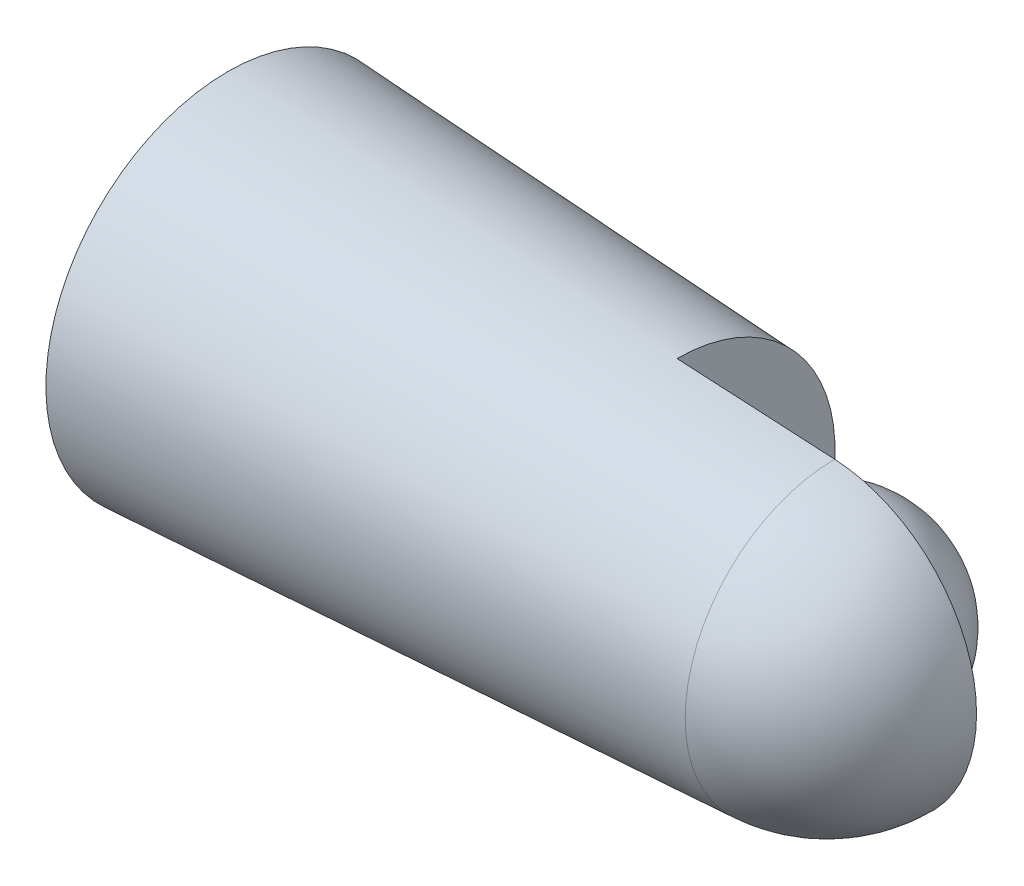
ISO-10303-21;
HEADER;
FILE_DESCRIPTION(('STEP AP214'),'2;1');
FILE_NAME('part.step','',(''),(''),'','','');
FILE_SCHEMA(('AUTOMOTIVE_DESIGN { 1 0 10303 214 1 1 1 1 }'));
ENDSEC;
DATA;
#1=APPLICATION_CONTEXT('core data for automotive mechanical design processes');
#2=APPLICATION_PROTOCOL_DEFINITION('international standard','automotive_design',2000,#1);
#3=PRODUCT_CONTEXT('',#1,'mechanical');
#4=PRODUCT('Part','Part','',(#3));
#5=PRODUCT_RELATED_PRODUCT_CATEGORY('part','',(#4));
#6=PRODUCT_DEFINITION_FORMATION('','',#4);
#7=PRODUCT_DEFINITION_CONTEXT('part definition',#1,'design');
#8=PRODUCT_DEFINITION('design','',#6,#7);
#9=PRODUCT_DEFINITION_SHAPE('','',#8);
#10=(LENGTH_UNIT() NAMED_UNIT(*) SI_UNIT(.MILLI.,.METRE.));
#11=(NAMED_UNIT(*) PLANE_ANGLE_UNIT() SI_UNIT($,.RADIAN.));
#12=(NAMED_UNIT(*) SI_UNIT($,.STERADIAN.) SOLID_ANGLE_UNIT());
#13=UNCERTAINTY_MEASURE_WITH_UNIT(LENGTH_MEASURE(1.E-05),#10,'distance_accuracy_value','');
#14=(GEOMETRIC_REPRESENTATION_CONTEXT(3) GLOBAL_UNCERTAINTY_ASSIGNED_CONTEXT((#13)) GLOBAL_UNIT_ASSIGNED_CONTEXT((#10,
#11,#12)) REPRESENTATION_CONTEXT('',''));
#15=CARTESIAN_POINT('',(0.,0.,0.));
#16=DIRECTION('',(0.,0.,1.));
#17=DIRECTION('',(1.,0.,0.));
#18=AXIS2_PLACEMENT_3D('',#15,#16,#17);
#19=CARTESIAN_POINT('',(0.,0.,0.));
#20=DIRECTION('',(1.,0.,0.));
#21=DIRECTION('',(0.,0.,1.));
#22=AXIS2_PLACEMENT_3D('',#19,#20,#21);
#23=SPHERICAL_SURFACE('',#22,35.);
#24=CARTESIAN_POINT('',(1.8599862468664,0.,0.));
#25=DIRECTION('',(1.,0.,0.));
#26=DIRECTION('',(0.,0.,-1.));
#27=AXIS2_PLACEMENT_3D('',#24,#25,#26);
#28=CIRCLE('',#27,34.950542930854);
#29=CARTESIAN_POINT('',(1.8599862468664,34.950542930854,0.));
#30=VERTEX_POINT('',#29);
#31=CARTESIAN_POINT('',(1.8599862468664,-34.950542930854,0.));
#32=VERTEX_POINT('',#31);
#33=EDGE_CURVE('E69',#30,#32,#28,.T.);
#34=ORIENTED_EDGE('',*,*,#33,.T.);
#35=CARTESIAN_POINT('',(0.,0.,0.));
#36=DIRECTION('',(0.,0.,1.));
#37=DIRECTION('',(1.,0.,0.));
#38=AXIS2_PLACEMENT_3D('',#35,#36,#37);
#39=CIRCLE('',#38,35.);
#40=EDGE_CURVE('E46',#30,#32,#39,.F.);
#41=ORIENTED_EDGE('',*,*,#40,.F.);
#42=EDGE_LOOP('',(#34,#41));
#43=FACE_BOUND('',#42,.T.);
#44=ADVANCED_FACE('F32',(#43),#23,.T.);
#45=CARTESIAN_POINT('',(1.8599862468664,0.,0.));
#46=DIRECTION('',(-1.,0.,0.));
#47=DIRECTION('',(0.,0.,1.));
#48=AXIS2_PLACEMENT_3D('',#45,#46,#47);
#49=CONICAL_SURFACE('',#48,34.950542930854,0.0531675095008227);
#50=DIRECTION('',(-0.998586940881543,0.0531424641961826,0.));
#51=VECTOR('',#50,1.);
#52=CARTESIAN_POINT('',(658.607020381907,0.,0.));
#53=LINE('',#52,#51);
#54=CARTESIAN_POINT('',(-35.0000000000001,36.9121452903507,0.));
#55=VERTEX_POINT('',#54);
#56=EDGE_CURVE('E11',#55,#30,#53,.F.);
#57=ORIENTED_EDGE('',*,*,#56,.F.);
#58=CARTESIAN_POINT('',(-35.,0.,0.));
#59=DIRECTION('',(-1.,0.,0.));
#60=DIRECTION('',(0.,0.,1.));
#61=AXIS2_PLACEMENT_3D('',#58,#59,#60);
#62=CIRCLE('',#61,36.9121452903507);
#63=CARTESIAN_POINT('',(-35.0000000000001,-36.9121452903508,0.));
#64=VERTEX_POINT('',#63);
#65=EDGE_CURVE('E40',#64,#55,#62,.F.);
#66=ORIENTED_EDGE('',*,*,#65,.F.);
#67=DIRECTION('',(0.998586940881543,0.0531424641961826,0.));
#68=VECTOR('',#67,1.);
#69=CARTESIAN_POINT('',(658.607020381907,0.,0.));
#70=LINE('',#69,#68);
#71=EDGE_CURVE('E61',#32,#64,#70,.F.);
#72=ORIENTED_EDGE('',*,*,#71,.F.);
#73=ORIENTED_EDGE('',*,*,#33,.F.);
#74=EDGE_LOOP('',(#57,#66,#72,#73));
#75=FACE_BOUND('',#74,.T.);
#76=CARTESIAN_POINT('',(-140.,0.,0.));
#77=DIRECTION('',(1.,0.,0.));
#78=DIRECTION('',(0.,0.,-1.));
#79=AXIS2_PLACEMENT_3D('',#76,#77,#78);
#80=CIRCLE('',#79,42.5);
#81=CARTESIAN_POINT('',(-140.,0.,-42.5));
#82=VERTEX_POINT('',#81);
#83=EDGE_CURVE('E71',#82,#82,#80,.T.);
#84=ORIENTED_EDGE('',*,*,#83,.T.);
#85=EDGE_LOOP('',(#84));
#86=FACE_BOUND('',#85,.T.);
#87=ADVANCED_FACE('F66',(#75,#86),#49,.T.);
#88=CARTESIAN_POINT('',(-140.,0.,0.));
#89=DIRECTION('',(-1.,0.,0.));
#90=DIRECTION('',(0.,0.,1.));
#91=AXIS2_PLACEMENT_3D('',#88,#89,#90);
#92=PLANE('',#91);
#93=CARTESIAN_POINT('',(-140.,0.,0.));
#94=DIRECTION('',(-1.,0.,0.));
#95=DIRECTION('',(0.,0.,1.));
#96=AXIS2_PLACEMENT_3D('',#93,#94,#95);
#97=CIRCLE('',#96,35.);
#98=CARTESIAN_POINT('',(-140.,0.,35.));
#99=VERTEX_POINT('',#98);
#100=EDGE_CURVE('E78',#99,#99,#97,.T.);
#101=ORIENTED_EDGE('',*,*,#100,.F.);
#102=EDGE_LOOP('',(#101));
#103=FACE_BOUND('',#102,.T.);
#104=ORIENTED_EDGE('',*,*,#83,.F.);
#105=EDGE_LOOP('',(#104));
#106=FACE_BOUND('',#105,.T.);
#107=ADVANCED_FACE('F90',(#103,#106),#92,.T.);
#108=CARTESIAN_POINT('',(-120.,0.,0.));
#109=DIRECTION('',(-1.,0.,0.));
#110=DIRECTION('',(0.,0.,1.));
#111=AXIS2_PLACEMENT_3D('',#108,#109,#110);
#112=CYLINDRICAL_SURFACE('',#111,35.);
#113=CARTESIAN_POINT('',(-120.,0.,0.));
#114=DIRECTION('',(-1.,0.,0.));
#115=DIRECTION('',(0.,0.,1.));
#116=AXIS2_PLACEMENT_3D('',#113,#114,#115);
#117=CIRCLE('',#116,35.);
#118=CARTESIAN_POINT('',(-120.,0.,35.));
#119=VERTEX_POINT('',#118);
#120=EDGE_CURVE('E75',#119,#119,#117,.T.);
#121=ORIENTED_EDGE('',*,*,#120,.F.);
#122=EDGE_LOOP('',(#121));
#123=FACE_BOUND('',#122,.T.);
#124=ORIENTED_EDGE('',*,*,#100,.T.);
#125=EDGE_LOOP('',(#124));
#126=FACE_BOUND('',#125,.T.);
#127=ADVANCED_FACE('F87',(#123,#126),#112,.F.);
#128=CARTESIAN_POINT('',(-120.,0.,0.));
#129=DIRECTION('',(-1.,0.,0.));
#130=DIRECTION('',(0.,0.,1.));
#131=AXIS2_PLACEMENT_3D('',#128,#129,#130);
#132=PLANE('',#131);
#133=ORIENTED_EDGE('',*,*,#120,.T.);
#134=EDGE_LOOP('',(#133));
#135=FACE_BOUND('',#134,.T.);
#136=ADVANCED_FACE('F85',(#135),#132,.T.);
#137=CARTESIAN_POINT('',(-35.,-50.,-53.));
#138=DIRECTION('',(-1.,0.,0.));
#139=DIRECTION('',(0.,0.,1.));
#140=AXIS2_PLACEMENT_3D('',#137,#138,#139);
#141=PLANE('',#140);
#142=ORIENTED_EDGE('',*,*,#65,.T.);
#143=DIRECTION('',(0.,-1.,0.));
#144=VECTOR('',#143,1.);
#145=CARTESIAN_POINT('',(-35.,-50.,0.));
#146=LINE('',#145,#144);
#147=EDGE_CURVE('E59',#55,#64,#146,.T.);
#148=ORIENTED_EDGE('',*,*,#147,.T.);
#149=EDGE_LOOP('',(#142,#148));
#150=FACE_BOUND('',#149,.T.);
#151=ADVANCED_FACE('F58',(#150),#141,.F.);
#152=CARTESIAN_POINT('',(0.,0.,0.));
#153=DIRECTION('',(0.,0.,1.));
#154=DIRECTION('',(1.,0.,0.));
#155=AXIS2_PLACEMENT_3D('',#152,#153,#154);
#156=PLANE('',#155);
#157=CARTESIAN_POINT('',(0.,0.,0.));
#158=DIRECTION('',(0.,0.,1.));
#159=DIRECTION('',(1.,0.,0.));
#160=AXIS2_PLACEMENT_3D('',#157,#158,#159);
#161=CIRCLE('',#160,25.);
#162=CARTESIAN_POINT('',(25.,0.,0.));
#163=VERTEX_POINT('',#162);
#164=EDGE_CURVE('E35',#163,#163,#161,.T.);
#165=ORIENTED_EDGE('',*,*,#164,.T.);
#166=EDGE_LOOP('',(#165));
#167=FACE_BOUND('',#166,.T.);
#168=ORIENTED_EDGE('',*,*,#56,.T.);
#169=ORIENTED_EDGE('',*,*,#40,.T.);
#170=ORIENTED_EDGE('',*,*,#71,.T.);
#171=ORIENTED_EDGE('',*,*,#147,.F.);
#172=EDGE_LOOP('',(#168,#169,#170,#171));
#173=FACE_BOUND('',#172,.T.);
#174=ADVANCED_FACE('F63',(#167,#173),#156,.F.);
#175=CARTESIAN_POINT('',(0.,0.,0.));
#176=DIRECTION('',(1.,0.,0.));
#177=DIRECTION('',(0.,-1.,0.));
#178=AXIS2_PLACEMENT_3D('',#175,#176,#177);
#179=SPHERICAL_SURFACE('',#178,25.);
#180=CARTESIAN_POINT('',(0.,0.,0.));
#181=DIRECTION('',(0.,0.,1.));
#182=DIRECTION('',(1.,0.,0.));
#183=AXIS2_PLACEMENT_3D('',#180,#181,#182);
#184=SPHERICAL_SURFACE('',#183,25.);
#185=ORIENTED_EDGE('',*,*,#164,.F.);
#186=EDGE_LOOP('',(#185));
#187=FACE_BOUND('',#186,.T.);
#188=ADVANCED_FACE('F109',(#187),#184,.T.);
#189=CLOSED_SHELL('',(#44,#87,#107,#127,#136,#151,#174,#188));
#190=MANIFOLD_SOLID_BREP('B2',#189);
#191=ADVANCED_BREP_SHAPE_REPRESENTATION('',(#18,#190),#14);
#192=SHAPE_DEFINITION_REPRESENTATION(#9,#191);
ENDSEC;
END-ISO-10303-21;
